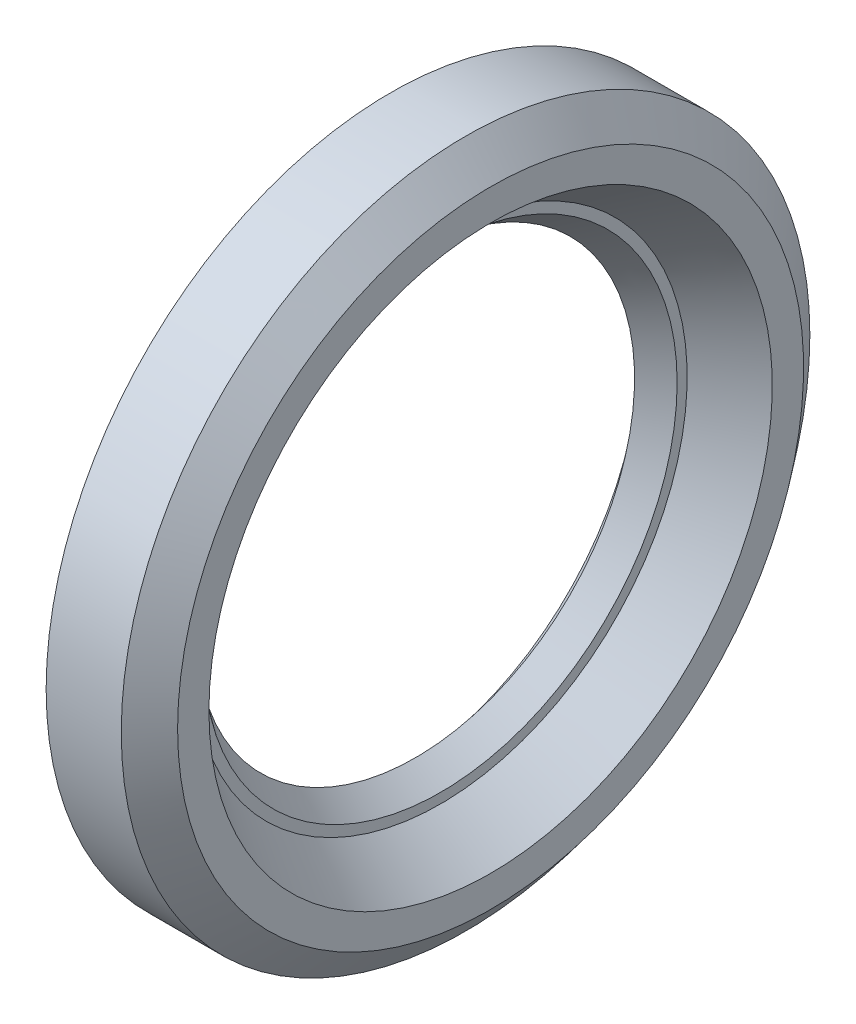
ISO-10303-21;
HEADER;
FILE_DESCRIPTION(('STEP AP214'),'2;1');
FILE_NAME('part.step','',(''),(''),'','','');
FILE_SCHEMA(('AUTOMOTIVE_DESIGN { 1 0 10303 214 1 1 1 1 }'));
ENDSEC;
DATA;
#1=APPLICATION_CONTEXT('core data for automotive mechanical design processes');
#2=APPLICATION_PROTOCOL_DEFINITION('international standard','automotive_design',2000,#1);
#3=PRODUCT_CONTEXT('',#1,'mechanical');
#4=PRODUCT('Part','Part','',(#3));
#5=PRODUCT_RELATED_PRODUCT_CATEGORY('part','',(#4));
#6=PRODUCT_DEFINITION_FORMATION('','',#4);
#7=PRODUCT_DEFINITION_CONTEXT('part definition',#1,'design');
#8=PRODUCT_DEFINITION('design','',#6,#7);
#9=PRODUCT_DEFINITION_SHAPE('','',#8);
#10=(LENGTH_UNIT() NAMED_UNIT(*) SI_UNIT(.MILLI.,.METRE.));
#11=(NAMED_UNIT(*) PLANE_ANGLE_UNIT() SI_UNIT($,.RADIAN.));
#12=(NAMED_UNIT(*) SI_UNIT($,.STERADIAN.) SOLID_ANGLE_UNIT());
#13=UNCERTAINTY_MEASURE_WITH_UNIT(LENGTH_MEASURE(1.E-05),#10,'distance_accuracy_value','');
#14=(GEOMETRIC_REPRESENTATION_CONTEXT(3) GLOBAL_UNCERTAINTY_ASSIGNED_CONTEXT((#13)) GLOBAL_UNIT_ASSIGNED_CONTEXT((#10,
#11,#12)) REPRESENTATION_CONTEXT('',''));
#15=CARTESIAN_POINT('',(0.,0.,0.));
#16=DIRECTION('',(0.,0.,1.));
#17=DIRECTION('',(1.,0.,0.));
#18=AXIS2_PLACEMENT_3D('',#15,#16,#17);
#19=CARTESIAN_POINT('',(-1000.,0.,0.));
#20=DIRECTION('',(-1.,0.,0.));
#21=DIRECTION('',(0.,0.,1.));
#22=AXIS2_PLACEMENT_3D('',#19,#20,#21);
#23=CYLINDRICAL_SURFACE('',#22,25.);
#24=CARTESIAN_POINT('',(4.,0.,0.));
#25=DIRECTION('',(-1.,0.,0.));
#26=DIRECTION('',(0.,0.,1.));
#27=AXIS2_PLACEMENT_3D('',#24,#25,#26);
#28=CIRCLE('',#27,25.);
#29=CARTESIAN_POINT('',(4.,0.,25.));
#30=VERTEX_POINT('',#29);
#31=EDGE_CURVE('E73',#30,#30,#28,.T.);
#32=ORIENTED_EDGE('',*,*,#31,.F.);
#33=EDGE_LOOP('',(#32));
#34=FACE_BOUND('',#33,.T.);
#35=CARTESIAN_POINT('',(0.,0.,0.));
#36=DIRECTION('',(-1.,0.,0.));
#37=DIRECTION('',(0.,0.,1.));
#38=AXIS2_PLACEMENT_3D('',#35,#36,#37);
#39=CIRCLE('',#38,25.);
#40=CARTESIAN_POINT('',(0.,0.,25.));
#41=VERTEX_POINT('',#40);
#42=EDGE_CURVE('E10',#41,#41,#39,.T.);
#43=ORIENTED_EDGE('',*,*,#42,.T.);
#44=EDGE_LOOP('',(#43));
#45=FACE_BOUND('',#44,.T.);
#46=ADVANCED_FACE('F33',(#34,#45),#23,.F.);
#47=CARTESIAN_POINT('',(0.,27.5,0.));
#48=DIRECTION('',(1.,0.,0.));
#49=DIRECTION('',(0.,0.,-1.));
#50=AXIS2_PLACEMENT_3D('',#47,#48,#49);
#51=PLANE('',#50);
#52=ORIENTED_EDGE('',*,*,#42,.F.);
#53=EDGE_LOOP('',(#52));
#54=FACE_BOUND('',#53,.T.);
#55=CARTESIAN_POINT('',(0.,0.,0.));
#56=DIRECTION('',(-1.,0.,0.));
#57=DIRECTION('',(0.,0.,1.));
#58=AXIS2_PLACEMENT_3D('',#55,#56,#57);
#59=CIRCLE('',#58,27.5);
#60=CARTESIAN_POINT('',(0.,0.,27.5));
#61=VERTEX_POINT('',#60);
#62=EDGE_CURVE('E39',#61,#61,#59,.T.);
#63=ORIENTED_EDGE('',*,*,#62,.T.);
#64=EDGE_LOOP('',(#63));
#65=FACE_BOUND('',#64,.T.);
#66=ADVANCED_FACE('F80',(#54,#65),#51,.F.);
#67=CARTESIAN_POINT('',(-1000.,0.,0.));
#68=DIRECTION('',(-1.,0.,0.));
#69=DIRECTION('',(0.,0.,1.));
#70=AXIS2_PLACEMENT_3D('',#67,#68,#69);
#71=CYLINDRICAL_SURFACE('',#70,27.5);
#72=ORIENTED_EDGE('',*,*,#62,.F.);
#73=EDGE_LOOP('',(#72));
#74=FACE_BOUND('',#73,.T.);
#75=CARTESIAN_POINT('',(6.00000000000001,0.,0.));
#76=DIRECTION('',(-1.,0.,0.));
#77=DIRECTION('',(0.,0.,1.));
#78=AXIS2_PLACEMENT_3D('',#75,#76,#77);
#79=CIRCLE('',#78,27.5);
#80=CARTESIAN_POINT('',(6.00000000000001,0.,27.5));
#81=VERTEX_POINT('',#80);
#82=EDGE_CURVE('E43',#81,#81,#79,.T.);
#83=ORIENTED_EDGE('',*,*,#82,.T.);
#84=EDGE_LOOP('',(#83));
#85=FACE_BOUND('',#84,.T.);
#86=ADVANCED_FACE('F84',(#74,#85),#71,.T.);
#87=CARTESIAN_POINT('',(8.00000000000001,0.,0.));
#88=DIRECTION('',(-1.,0.,0.));
#89=DIRECTION('',(0.,0.,1.));
#90=AXIS2_PLACEMENT_3D('',#87,#88,#89);
#91=CONICAL_SURFACE('',#90,25.,0.896055384571343);
#92=ORIENTED_EDGE('',*,*,#82,.F.);
#93=EDGE_LOOP('',(#92));
#94=FACE_BOUND('',#93,.T.);
#95=CARTESIAN_POINT('',(8.00000000000001,0.,0.));
#96=DIRECTION('',(-1.,0.,0.));
#97=DIRECTION('',(0.,0.,1.));
#98=AXIS2_PLACEMENT_3D('',#95,#96,#97);
#99=CIRCLE('',#98,25.);
#100=CARTESIAN_POINT('',(8.00000000000001,0.,25.));
#101=VERTEX_POINT('',#100);
#102=EDGE_CURVE('E47',#101,#101,#99,.T.);
#103=ORIENTED_EDGE('',*,*,#102,.T.);
#104=EDGE_LOOP('',(#103));
#105=FACE_BOUND('',#104,.T.);
#106=ADVANCED_FACE('F89',(#94,#105),#91,.T.);
#107=CARTESIAN_POINT('',(8.,22.5,0.));
#108=DIRECTION('',(-1.,0.,0.));
#109=DIRECTION('',(0.,0.,1.));
#110=AXIS2_PLACEMENT_3D('',#107,#108,#109);
#111=PLANE('',#110);
#112=ORIENTED_EDGE('',*,*,#102,.F.);
#113=EDGE_LOOP('',(#112));
#114=FACE_BOUND('',#113,.T.);
#115=CARTESIAN_POINT('',(8.00000000000001,0.,0.));
#116=DIRECTION('',(-1.,0.,0.));
#117=DIRECTION('',(0.,0.,1.));
#118=AXIS2_PLACEMENT_3D('',#115,#116,#117);
#119=CIRCLE('',#118,22.5);
#120=CARTESIAN_POINT('',(8.00000000000001,0.,22.5));
#121=VERTEX_POINT('',#120);
#122=EDGE_CURVE('E52',#121,#121,#119,.T.);
#123=ORIENTED_EDGE('',*,*,#122,.T.);
#124=EDGE_LOOP('',(#123));
#125=FACE_BOUND('',#124,.T.);
#126=ADVANCED_FACE('F95',(#114,#125),#111,.F.);
#127=CARTESIAN_POINT('',(4.,0.,0.));
#128=DIRECTION('',(1.,0.,0.));
#129=DIRECTION('',(0.,0.,-1.));
#130=AXIS2_PLACEMENT_3D('',#127,#128,#129);
#131=CONICAL_SURFACE('',#130,19.7002603531194,0.610682279644131);
#132=ORIENTED_EDGE('',*,*,#122,.F.);
#133=EDGE_LOOP('',(#132));
#134=FACE_BOUND('',#133,.T.);
#135=CARTESIAN_POINT('',(4.,0.,0.));
#136=DIRECTION('',(-1.,0.,0.));
#137=DIRECTION('',(0.,0.,1.));
#138=AXIS2_PLACEMENT_3D('',#135,#136,#137);
#139=CIRCLE('',#138,19.7002603531194);
#140=CARTESIAN_POINT('',(4.,0.,19.7002603531194));
#141=VERTEX_POINT('',#140);
#142=EDGE_CURVE('E55',#141,#141,#139,.T.);
#143=ORIENTED_EDGE('',*,*,#142,.T.);
#144=EDGE_LOOP('',(#143));
#145=FACE_BOUND('',#144,.T.);
#146=ADVANCED_FACE('F99',(#134,#145),#131,.F.);
#147=CARTESIAN_POINT('',(4.,18.8998698234403,0.));
#148=DIRECTION('',(-1.,0.,0.));
#149=DIRECTION('',(0.,0.,1.));
#150=AXIS2_PLACEMENT_3D('',#147,#148,#149);
#151=PLANE('',#150);
#152=ORIENTED_EDGE('',*,*,#142,.F.);
#153=EDGE_LOOP('',(#152));
#154=FACE_BOUND('',#153,.T.);
#155=CARTESIAN_POINT('',(4.,0.,0.));
#156=DIRECTION('',(-1.,0.,0.));
#157=DIRECTION('',(0.,0.,1.));
#158=AXIS2_PLACEMENT_3D('',#155,#156,#157);
#159=CIRCLE('',#158,18.8998698234403);
#160=CARTESIAN_POINT('',(4.,0.,18.8998698234403));
#161=VERTEX_POINT('',#160);
#162=EDGE_CURVE('E58',#161,#161,#159,.T.);
#163=ORIENTED_EDGE('',*,*,#162,.T.);
#164=EDGE_LOOP('',(#163));
#165=FACE_BOUND('',#164,.T.);
#166=ADVANCED_FACE('F103',(#154,#165),#151,.F.);
#167=CARTESIAN_POINT('',(2.,0.,0.));
#168=DIRECTION('',(1.,0.,0.));
#169=DIRECTION('',(0.,0.,-1.));
#170=AXIS2_PLACEMENT_3D('',#167,#168,#169);
#171=CONICAL_SURFACE('',#170,17.5,0.610682279644131);
#172=ORIENTED_EDGE('',*,*,#162,.F.);
#173=EDGE_LOOP('',(#172));
#174=FACE_BOUND('',#173,.T.);
#175=CARTESIAN_POINT('',(2.,0.,0.));
#176=DIRECTION('',(-1.,0.,0.));
#177=DIRECTION('',(0.,0.,1.));
#178=AXIS2_PLACEMENT_3D('',#175,#176,#177);
#179=CIRCLE('',#178,17.5);
#180=CARTESIAN_POINT('',(2.,0.,17.5));
#181=VERTEX_POINT('',#180);
#182=EDGE_CURVE('E61',#181,#181,#179,.T.);
#183=ORIENTED_EDGE('',*,*,#182,.T.);
#184=EDGE_LOOP('',(#183));
#185=FACE_BOUND('',#184,.T.);
#186=ADVANCED_FACE('F107',(#174,#185),#171,.F.);
#187=CARTESIAN_POINT('',(0.499999999999945,0.,0.));
#188=DIRECTION('',(-1.,0.,0.));
#189=DIRECTION('',(0.,0.,1.));
#190=AXIS2_PLACEMENT_3D('',#187,#188,#189);
#191=CONICAL_SURFACE('',#190,19.375,0.896055384571325);
#192=ORIENTED_EDGE('',*,*,#182,.F.);
#193=EDGE_LOOP('',(#192));
#194=FACE_BOUND('',#193,.T.);
#195=CARTESIAN_POINT('',(0.499999999999945,0.,0.));
#196=DIRECTION('',(-1.,0.,0.));
#197=DIRECTION('',(0.,0.,1.));
#198=AXIS2_PLACEMENT_3D('',#195,#196,#197);
#199=CIRCLE('',#198,19.375);
#200=CARTESIAN_POINT('',(0.499999999999945,0.,19.375));
#201=VERTEX_POINT('',#200);
#202=EDGE_CURVE('E64',#201,#201,#199,.T.);
#203=ORIENTED_EDGE('',*,*,#202,.T.);
#204=EDGE_LOOP('',(#203));
#205=FACE_BOUND('',#204,.T.);
#206=ADVANCED_FACE('F111',(#194,#205),#191,.F.);
#207=CARTESIAN_POINT('',(0.5,22.5,0.));
#208=DIRECTION('',(1.,0.,0.));
#209=DIRECTION('',(0.,0.,-1.));
#210=AXIS2_PLACEMENT_3D('',#207,#208,#209);
#211=PLANE('',#210);
#212=ORIENTED_EDGE('',*,*,#202,.F.);
#213=EDGE_LOOP('',(#212));
#214=FACE_BOUND('',#213,.T.);
#215=CARTESIAN_POINT('',(0.499999999999945,0.,0.));
#216=DIRECTION('',(-1.,0.,0.));
#217=DIRECTION('',(0.,0.,1.));
#218=AXIS2_PLACEMENT_3D('',#215,#216,#217);
#219=CIRCLE('',#218,22.5);
#220=CARTESIAN_POINT('',(0.499999999999945,0.,22.5));
#221=VERTEX_POINT('',#220);
#222=EDGE_CURVE('E67',#221,#221,#219,.T.);
#223=ORIENTED_EDGE('',*,*,#222,.T.);
#224=EDGE_LOOP('',(#223));
#225=FACE_BOUND('',#224,.T.);
#226=ADVANCED_FACE('F115',(#214,#225),#211,.F.);
#227=CARTESIAN_POINT('',(-1000.,0.,0.));
#228=DIRECTION('',(-1.,0.,0.));
#229=DIRECTION('',(0.,0.,1.));
#230=AXIS2_PLACEMENT_3D('',#227,#228,#229);
#231=CYLINDRICAL_SURFACE('',#230,22.5);
#232=ORIENTED_EDGE('',*,*,#222,.F.);
#233=EDGE_LOOP('',(#232));
#234=FACE_BOUND('',#233,.T.);
#235=CARTESIAN_POINT('',(4.,0.,0.));
#236=DIRECTION('',(-1.,0.,0.));
#237=DIRECTION('',(0.,0.,1.));
#238=AXIS2_PLACEMENT_3D('',#235,#236,#237);
#239=CIRCLE('',#238,22.5);
#240=CARTESIAN_POINT('',(4.,0.,22.5));
#241=VERTEX_POINT('',#240);
#242=EDGE_CURVE('E70',#241,#241,#239,.T.);
#243=ORIENTED_EDGE('',*,*,#242,.T.);
#244=EDGE_LOOP('',(#243));
#245=FACE_BOUND('',#244,.T.);
#246=ADVANCED_FACE('F119',(#234,#245),#231,.T.);
#247=CARTESIAN_POINT('',(4.,25.,0.));
#248=DIRECTION('',(1.,0.,0.));
#249=DIRECTION('',(0.,0.,-1.));
#250=AXIS2_PLACEMENT_3D('',#247,#248,#249);
#251=PLANE('',#250);
#252=ORIENTED_EDGE('',*,*,#242,.F.);
#253=EDGE_LOOP('',(#252));
#254=FACE_BOUND('',#253,.T.);
#255=ORIENTED_EDGE('',*,*,#31,.T.);
#256=EDGE_LOOP('',(#255));
#257=FACE_BOUND('',#256,.T.);
#258=ADVANCED_FACE('F77',(#254,#257),#251,.F.);
#259=CLOSED_SHELL('',(#46,#66,#86,#106,#126,#146,#166,#186,#206,#226,#246,#258));
#260=MANIFOLD_SOLID_BREP('B2',#259);
#261=ADVANCED_BREP_SHAPE_REPRESENTATION('',(#18,#260),#14);
#262=SHAPE_DEFINITION_REPRESENTATION(#9,#261);
ENDSEC;
END-ISO-10303-21;
